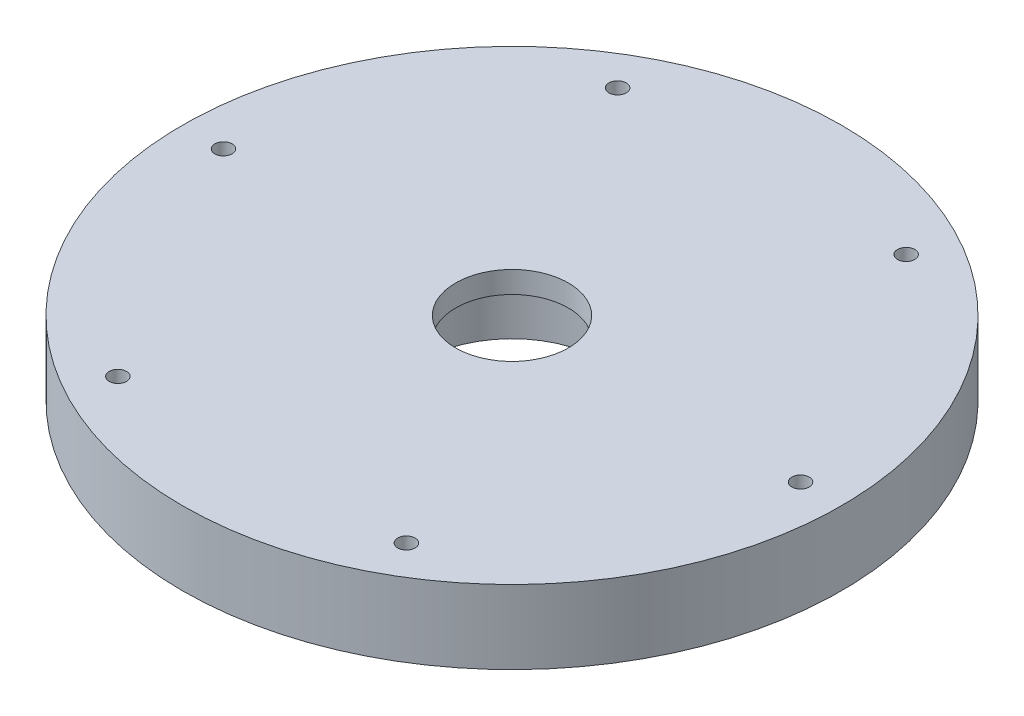
ISO-10303-21;
HEADER;
FILE_DESCRIPTION(('STEP AP214'),'2;1');
FILE_NAME('part.step','',(''),(''),'','','');
FILE_SCHEMA(('AUTOMOTIVE_DESIGN { 1 0 10303 214 1 1 1 1 }'));
ENDSEC;
DATA;
#1=APPLICATION_CONTEXT('core data for automotive mechanical design processes');
#2=APPLICATION_PROTOCOL_DEFINITION('international standard','automotive_design',2000,#1);
#3=PRODUCT_CONTEXT('',#1,'mechanical');
#4=PRODUCT('Part','Part','',(#3));
#5=PRODUCT_RELATED_PRODUCT_CATEGORY('part','',(#4));
#6=PRODUCT_DEFINITION_FORMATION('','',#4);
#7=PRODUCT_DEFINITION_CONTEXT('part definition',#1,'design');
#8=PRODUCT_DEFINITION('design','',#6,#7);
#9=PRODUCT_DEFINITION_SHAPE('','',#8);
#10=(LENGTH_UNIT() NAMED_UNIT(*) SI_UNIT(.MILLI.,.METRE.));
#11=(NAMED_UNIT(*) PLANE_ANGLE_UNIT() SI_UNIT($,.RADIAN.));
#12=(NAMED_UNIT(*) SI_UNIT($,.STERADIAN.) SOLID_ANGLE_UNIT());
#13=UNCERTAINTY_MEASURE_WITH_UNIT(LENGTH_MEASURE(1.E-05),#10,'distance_accuracy_value','');
#14=(GEOMETRIC_REPRESENTATION_CONTEXT(3) GLOBAL_UNCERTAINTY_ASSIGNED_CONTEXT((#13)) GLOBAL_UNIT_ASSIGNED_CONTEXT((#10,
#11,#12)) REPRESENTATION_CONTEXT('',''));
#15=CARTESIAN_POINT('',(0.,0.,0.));
#16=DIRECTION('',(0.,0.,1.));
#17=DIRECTION('',(1.,0.,0.));
#18=AXIS2_PLACEMENT_3D('',#15,#16,#17);
#19=CARTESIAN_POINT('',(0.,38.7086688188191,0.));
#20=DIRECTION('',(0.,1.,0.));
#21=DIRECTION('',(0.,0.,1.));
#22=AXIS2_PLACEMENT_3D('',#19,#20,#21);
#23=CYLINDRICAL_SURFACE('',#22,6.49999999999999);
#24=CARTESIAN_POINT('',(0.,0.,0.));
#25=DIRECTION('',(0.,1.,0.));
#26=DIRECTION('',(0.,0.,1.));
#27=AXIS2_PLACEMENT_3D('',#24,#25,#26);
#28=CIRCLE('',#27,6.49999999999999);
#29=CARTESIAN_POINT('',(0.,0.,6.49999999999999));
#30=VERTEX_POINT('',#29);
#31=EDGE_CURVE('E10',#30,#30,#28,.T.);
#32=ORIENTED_EDGE('',*,*,#31,.T.);
#33=EDGE_LOOP('',(#32));
#34=FACE_BOUND('',#33,.T.);
#35=CARTESIAN_POINT('',(0.,-2.5,0.));
#36=DIRECTION('',(0.,1.,0.));
#37=DIRECTION('',(0.,0.,1.));
#38=AXIS2_PLACEMENT_3D('',#35,#36,#37);
#39=CIRCLE('',#38,6.49999999999999);
#40=CARTESIAN_POINT('',(0.,-2.5,6.49999999999999));
#41=VERTEX_POINT('',#40);
#42=EDGE_CURVE('E63',#41,#41,#39,.T.);
#43=ORIENTED_EDGE('',*,*,#42,.F.);
#44=EDGE_LOOP('',(#43));
#45=FACE_BOUND('',#44,.T.);
#46=ADVANCED_FACE('F35',(#34,#45),#23,.F.);
#47=CARTESIAN_POINT('',(-6.49999999999999,0.,0.));
#48=DIRECTION('',(0.,1.,0.));
#49=DIRECTION('',(0.,0.,1.));
#50=AXIS2_PLACEMENT_3D('',#47,#48,#49);
#51=PLANE('',#50);
#52=CARTESIAN_POINT('',(-33.26875,0.,0.));
#53=DIRECTION('',(0.,-1.,0.));
#54=DIRECTION('',(0.,0.,-1.));
#55=AXIS2_PLACEMENT_3D('',#52,#53,#54);
#56=CIRCLE('',#55,0.999999999999998);
#57=CARTESIAN_POINT('',(-33.26875,0.,-0.999999999999992));
#58=VERTEX_POINT('',#57);
#59=EDGE_CURVE('E66',#58,#58,#56,.T.);
#60=ORIENTED_EDGE('',*,*,#59,.T.);
#61=EDGE_LOOP('',(#60));
#62=FACE_BOUND('',#61,.T.);
#63=CARTESIAN_POINT('',(-16.634375,0.,-28.8115826521536));
#64=DIRECTION('',(0.,-1.,0.));
#65=DIRECTION('',(0.,0.,-1.));
#66=AXIS2_PLACEMENT_3D('',#63,#64,#65);
#67=CIRCLE('',#66,0.999999999999998);
#68=CARTESIAN_POINT('',(-16.634375,0.,-29.8115826521536));
#69=VERTEX_POINT('',#68);
#70=EDGE_CURVE('E93',#69,#69,#67,.T.);
#71=ORIENTED_EDGE('',*,*,#70,.T.);
#72=EDGE_LOOP('',(#71));
#73=FACE_BOUND('',#72,.T.);
#74=CARTESIAN_POINT('',(16.634375,0.,-28.8115826521535));
#75=DIRECTION('',(0.,-1.,0.));
#76=DIRECTION('',(0.,0.,-1.));
#77=AXIS2_PLACEMENT_3D('',#74,#75,#76);
#78=CIRCLE('',#77,0.999999999999998);
#79=CARTESIAN_POINT('',(16.634375,0.,-29.8115826521535));
#80=VERTEX_POINT('',#79);
#81=EDGE_CURVE('E67',#80,#80,#78,.T.);
#82=ORIENTED_EDGE('',*,*,#81,.T.);
#83=EDGE_LOOP('',(#82));
#84=FACE_BOUND('',#83,.T.);
#85=CARTESIAN_POINT('',(33.26875,0.,0.));
#86=DIRECTION('',(0.,-1.,0.));
#87=DIRECTION('',(0.,0.,-1.));
#88=AXIS2_PLACEMENT_3D('',#85,#86,#87);
#89=CIRCLE('',#88,0.999999999999998);
#90=CARTESIAN_POINT('',(33.26875,0.,-1.));
#91=VERTEX_POINT('',#90);
#92=EDGE_CURVE('E74',#91,#91,#89,.T.);
#93=ORIENTED_EDGE('',*,*,#92,.T.);
#94=EDGE_LOOP('',(#93));
#95=FACE_BOUND('',#94,.T.);
#96=CARTESIAN_POINT('',(16.634375,0.,28.8115826521535));
#97=DIRECTION('',(0.,-1.,0.));
#98=DIRECTION('',(0.,0.,-1.));
#99=AXIS2_PLACEMENT_3D('',#96,#97,#98);
#100=CIRCLE('',#99,1.);
#101=CARTESIAN_POINT('',(16.634375,0.,27.8115826521535));
#102=VERTEX_POINT('',#101);
#103=EDGE_CURVE('E80',#102,#102,#100,.T.);
#104=ORIENTED_EDGE('',*,*,#103,.T.);
#105=EDGE_LOOP('',(#104));
#106=FACE_BOUND('',#105,.T.);
#107=CARTESIAN_POINT('',(-16.634375,0.,28.8115826521535));
#108=DIRECTION('',(0.,-1.,0.));
#109=DIRECTION('',(0.,0.,-1.));
#110=AXIS2_PLACEMENT_3D('',#107,#108,#109);
#111=CIRCLE('',#110,0.999999999999998);
#112=CARTESIAN_POINT('',(-16.634375,0.,27.8115826521535));
#113=VERTEX_POINT('',#112);
#114=EDGE_CURVE('E86',#113,#113,#111,.T.);
#115=ORIENTED_EDGE('',*,*,#114,.T.);
#116=EDGE_LOOP('',(#115));
#117=FACE_BOUND('',#116,.T.);
#118=CARTESIAN_POINT('',(0.,0.,0.));
#119=DIRECTION('',(0.,1.,0.));
#120=DIRECTION('',(0.,0.,1.));
#121=AXIS2_PLACEMENT_3D('',#118,#119,#120);
#122=CIRCLE('',#121,38.);
#123=CARTESIAN_POINT('',(0.,0.,38.));
#124=VERTEX_POINT('',#123);
#125=EDGE_CURVE('E41',#124,#124,#122,.T.);
#126=ORIENTED_EDGE('',*,*,#125,.T.);
#127=EDGE_LOOP('',(#126));
#128=FACE_BOUND('',#127,.T.);
#129=ORIENTED_EDGE('',*,*,#31,.F.);
#130=EDGE_LOOP('',(#129));
#131=FACE_BOUND('',#130,.T.);
#132=ADVANCED_FACE('F103',(#62,#73,#84,#95,#106,#117,#128,#131),#51,.T.);
#133=CARTESIAN_POINT('',(0.,38.7086688188191,0.));
#134=DIRECTION('',(0.,1.,0.));
#135=DIRECTION('',(0.,0.,1.));
#136=AXIS2_PLACEMENT_3D('',#133,#134,#135);
#137=CYLINDRICAL_SURFACE('',#136,38.);
#138=CARTESIAN_POINT('',(0.,-8.5,0.));
#139=DIRECTION('',(0.,1.,0.));
#140=DIRECTION('',(0.,0.,1.));
#141=AXIS2_PLACEMENT_3D('',#138,#139,#140);
#142=CIRCLE('',#141,38.);
#143=CARTESIAN_POINT('',(0.,-8.5,38.));
#144=VERTEX_POINT('',#143);
#145=EDGE_CURVE('E45',#144,#144,#142,.T.);
#146=ORIENTED_EDGE('',*,*,#145,.T.);
#147=EDGE_LOOP('',(#146));
#148=FACE_BOUND('',#147,.T.);
#149=ORIENTED_EDGE('',*,*,#125,.F.);
#150=EDGE_LOOP('',(#149));
#151=FACE_BOUND('',#150,.T.);
#152=ADVANCED_FACE('F141',(#148,#151),#137,.T.);
#153=CARTESIAN_POINT('',(-35.,-8.5,0.));
#154=DIRECTION('',(0.,-1.,0.));
#155=DIRECTION('',(0.,0.,-1.));
#156=AXIS2_PLACEMENT_3D('',#153,#154,#155);
#157=PLANE('',#156);
#158=CARTESIAN_POINT('',(0.,-8.5,0.));
#159=DIRECTION('',(0.,1.,0.));
#160=DIRECTION('',(0.,0.,1.));
#161=AXIS2_PLACEMENT_3D('',#158,#159,#160);
#162=CIRCLE('',#161,35.);
#163=CARTESIAN_POINT('',(0.,-8.5,35.));
#164=VERTEX_POINT('',#163);
#165=EDGE_CURVE('E49',#164,#164,#162,.T.);
#166=ORIENTED_EDGE('',*,*,#165,.T.);
#167=EDGE_LOOP('',(#166));
#168=FACE_BOUND('',#167,.T.);
#169=ORIENTED_EDGE('',*,*,#145,.F.);
#170=EDGE_LOOP('',(#169));
#171=FACE_BOUND('',#170,.T.);
#172=ADVANCED_FACE('F135',(#168,#171),#157,.T.);
#173=CARTESIAN_POINT('',(0.,38.7086688188191,0.));
#174=DIRECTION('',(0.,1.,0.));
#175=DIRECTION('',(0.,0.,1.));
#176=AXIS2_PLACEMENT_3D('',#173,#174,#175);
#177=CYLINDRICAL_SURFACE('',#176,35.);
#178=CARTESIAN_POINT('',(0.,-9.75,0.));
#179=DIRECTION('',(0.,1.,0.));
#180=DIRECTION('',(0.,0.,1.));
#181=AXIS2_PLACEMENT_3D('',#178,#179,#180);
#182=CIRCLE('',#181,35.);
#183=CARTESIAN_POINT('',(0.,-9.75,35.));
#184=VERTEX_POINT('',#183);
#185=EDGE_CURVE('E54',#184,#184,#182,.T.);
#186=ORIENTED_EDGE('',*,*,#185,.T.);
#187=EDGE_LOOP('',(#186));
#188=FACE_BOUND('',#187,.T.);
#189=ORIENTED_EDGE('',*,*,#165,.F.);
#190=EDGE_LOOP('',(#189));
#191=FACE_BOUND('',#190,.T.);
#192=ADVANCED_FACE('F117',(#188,#191),#177,.T.);
#193=CARTESIAN_POINT('',(-10.5,-9.75,0.));
#194=DIRECTION('',(0.,-1.,0.));
#195=DIRECTION('',(0.,0.,-1.));
#196=AXIS2_PLACEMENT_3D('',#193,#194,#195);
#197=PLANE('',#196);
#198=CARTESIAN_POINT('',(-33.26875,-9.75,0.));
#199=DIRECTION('',(0.,-1.,0.));
#200=DIRECTION('',(0.,0.,-1.));
#201=AXIS2_PLACEMENT_3D('',#198,#199,#200);
#202=CIRCLE('',#201,0.999999999999998);
#203=CARTESIAN_POINT('',(-33.26875,-9.75,-0.999999999999992));
#204=VERTEX_POINT('',#203);
#205=EDGE_CURVE('E92',#204,#204,#202,.T.);
#206=ORIENTED_EDGE('',*,*,#205,.F.);
#207=EDGE_LOOP('',(#206));
#208=FACE_BOUND('',#207,.T.);
#209=CARTESIAN_POINT('',(-16.634375,-9.75,-28.8115826521536));
#210=DIRECTION('',(0.,-1.,0.));
#211=DIRECTION('',(0.,0.,-1.));
#212=AXIS2_PLACEMENT_3D('',#209,#210,#211);
#213=CIRCLE('',#212,0.999999999999998);
#214=CARTESIAN_POINT('',(-16.634375,-9.75,-29.8115826521536));
#215=VERTEX_POINT('',#214);
#216=EDGE_CURVE('E71',#215,#215,#213,.T.);
#217=ORIENTED_EDGE('',*,*,#216,.F.);
#218=EDGE_LOOP('',(#217));
#219=FACE_BOUND('',#218,.T.);
#220=CARTESIAN_POINT('',(16.634375,-9.75,-28.8115826521535));
#221=DIRECTION('',(0.,-1.,0.));
#222=DIRECTION('',(0.,0.,-1.));
#223=AXIS2_PLACEMENT_3D('',#220,#221,#222);
#224=CIRCLE('',#223,0.999999999999998);
#225=CARTESIAN_POINT('',(16.634375,-9.75,-29.8115826521535));
#226=VERTEX_POINT('',#225);
#227=EDGE_CURVE('E70',#226,#226,#224,.T.);
#228=ORIENTED_EDGE('',*,*,#227,.F.);
#229=EDGE_LOOP('',(#228));
#230=FACE_BOUND('',#229,.T.);
#231=CARTESIAN_POINT('',(33.26875,-9.75,0.));
#232=DIRECTION('',(0.,-1.,0.));
#233=DIRECTION('',(0.,0.,-1.));
#234=AXIS2_PLACEMENT_3D('',#231,#232,#233);
#235=CIRCLE('',#234,0.999999999999998);
#236=CARTESIAN_POINT('',(33.26875,-9.75,-1.));
#237=VERTEX_POINT('',#236);
#238=EDGE_CURVE('E77',#237,#237,#235,.T.);
#239=ORIENTED_EDGE('',*,*,#238,.F.);
#240=EDGE_LOOP('',(#239));
#241=FACE_BOUND('',#240,.T.);
#242=CARTESIAN_POINT('',(16.634375,-9.75,28.8115826521535));
#243=DIRECTION('',(0.,-1.,0.));
#244=DIRECTION('',(0.,0.,-1.));
#245=AXIS2_PLACEMENT_3D('',#242,#243,#244);
#246=CIRCLE('',#245,1.);
#247=CARTESIAN_POINT('',(16.634375,-9.75,27.8115826521535));
#248=VERTEX_POINT('',#247);
#249=EDGE_CURVE('E83',#248,#248,#246,.T.);
#250=ORIENTED_EDGE('',*,*,#249,.F.);
#251=EDGE_LOOP('',(#250));
#252=FACE_BOUND('',#251,.T.);
#253=CARTESIAN_POINT('',(-16.634375,-9.75,28.8115826521535));
#254=DIRECTION('',(0.,-1.,0.));
#255=DIRECTION('',(0.,0.,-1.));
#256=AXIS2_PLACEMENT_3D('',#253,#254,#255);
#257=CIRCLE('',#256,0.999999999999998);
#258=CARTESIAN_POINT('',(-16.634375,-9.75,27.8115826521535));
#259=VERTEX_POINT('',#258);
#260=EDGE_CURVE('E89',#259,#259,#257,.T.);
#261=ORIENTED_EDGE('',*,*,#260,.F.);
#262=EDGE_LOOP('',(#261));
#263=FACE_BOUND('',#262,.T.);
#264=CARTESIAN_POINT('',(0.,-9.74999999999999,0.));
#265=DIRECTION('',(0.,1.,0.));
#266=DIRECTION('',(0.,0.,1.));
#267=AXIS2_PLACEMENT_3D('',#264,#265,#266);
#268=CIRCLE('',#267,10.5);
#269=CARTESIAN_POINT('',(0.,-9.74999999999999,10.5));
#270=VERTEX_POINT('',#269);
#271=EDGE_CURVE('E57',#270,#270,#268,.T.);
#272=ORIENTED_EDGE('',*,*,#271,.T.);
#273=EDGE_LOOP('',(#272));
#274=FACE_BOUND('',#273,.T.);
#275=ORIENTED_EDGE('',*,*,#185,.F.);
#276=EDGE_LOOP('',(#275));
#277=FACE_BOUND('',#276,.T.);
#278=ADVANCED_FACE('F113',(#208,#219,#230,#241,#252,#263,#274,#277),#197,.T.);
#279=CARTESIAN_POINT('',(0.,38.7086688188191,0.));
#280=DIRECTION('',(0.,1.,0.));
#281=DIRECTION('',(0.,0.,1.));
#282=AXIS2_PLACEMENT_3D('',#279,#280,#281);
#283=CYLINDRICAL_SURFACE('',#282,10.5);
#284=CARTESIAN_POINT('',(0.,-2.5,0.));
#285=DIRECTION('',(0.,1.,0.));
#286=DIRECTION('',(0.,0.,1.));
#287=AXIS2_PLACEMENT_3D('',#284,#285,#286);
#288=CIRCLE('',#287,10.5);
#289=CARTESIAN_POINT('',(0.,-2.5,10.5));
#290=VERTEX_POINT('',#289);
#291=EDGE_CURVE('E60',#290,#290,#288,.T.);
#292=ORIENTED_EDGE('',*,*,#291,.T.);
#293=EDGE_LOOP('',(#292));
#294=FACE_BOUND('',#293,.T.);
#295=ORIENTED_EDGE('',*,*,#271,.F.);
#296=EDGE_LOOP('',(#295));
#297=FACE_BOUND('',#296,.T.);
#298=ADVANCED_FACE('F116',(#294,#297),#283,.F.);
#299=CARTESIAN_POINT('',(-10.5,-2.5,0.));
#300=DIRECTION('',(0.,-1.,0.));
#301=DIRECTION('',(0.,0.,-1.));
#302=AXIS2_PLACEMENT_3D('',#299,#300,#301);
#303=PLANE('',#302);
#304=ORIENTED_EDGE('',*,*,#42,.T.);
#305=EDGE_LOOP('',(#304));
#306=FACE_BOUND('',#305,.T.);
#307=ORIENTED_EDGE('',*,*,#291,.F.);
#308=EDGE_LOOP('',(#307));
#309=FACE_BOUND('',#308,.T.);
#310=ADVANCED_FACE('F157',(#306,#309),#303,.T.);
#311=CARTESIAN_POINT('',(-16.634375,0.,28.8115826521535));
#312=DIRECTION('',(0.,-1.,0.));
#313=DIRECTION('',(0.,0.,-1.));
#314=AXIS2_PLACEMENT_3D('',#311,#312,#313);
#315=CYLINDRICAL_SURFACE('',#314,0.999999999999998);
#316=ORIENTED_EDGE('',*,*,#114,.F.);
#317=EDGE_LOOP('',(#316));
#318=FACE_BOUND('',#317,.T.);
#319=ORIENTED_EDGE('',*,*,#260,.T.);
#320=EDGE_LOOP('',(#319));
#321=FACE_BOUND('',#320,.T.);
#322=ADVANCED_FACE('F160',(#318,#321),#315,.F.);
#323=CARTESIAN_POINT('',(16.634375,0.,28.8115826521535));
#324=DIRECTION('',(0.,-1.,0.));
#325=DIRECTION('',(0.,0.,-1.));
#326=AXIS2_PLACEMENT_3D('',#323,#324,#325);
#327=CYLINDRICAL_SURFACE('',#326,1.);
#328=ORIENTED_EDGE('',*,*,#103,.F.);
#329=EDGE_LOOP('',(#328));
#330=FACE_BOUND('',#329,.T.);
#331=ORIENTED_EDGE('',*,*,#249,.T.);
#332=EDGE_LOOP('',(#331));
#333=FACE_BOUND('',#332,.T.);
#334=ADVANCED_FACE('F177',(#330,#333),#327,.F.);
#335=CARTESIAN_POINT('',(33.26875,0.,0.));
#336=DIRECTION('',(0.,-1.,0.));
#337=DIRECTION('',(0.,0.,-1.));
#338=AXIS2_PLACEMENT_3D('',#335,#336,#337);
#339=CYLINDRICAL_SURFACE('',#338,0.999999999999998);
#340=ORIENTED_EDGE('',*,*,#92,.F.);
#341=EDGE_LOOP('',(#340));
#342=FACE_BOUND('',#341,.T.);
#343=ORIENTED_EDGE('',*,*,#238,.T.);
#344=EDGE_LOOP('',(#343));
#345=FACE_BOUND('',#344,.T.);
#346=ADVANCED_FACE('F173',(#342,#345),#339,.F.);
#347=CARTESIAN_POINT('',(16.634375,0.,-28.8115826521535));
#348=DIRECTION('',(0.,-1.,0.));
#349=DIRECTION('',(0.,0.,-1.));
#350=AXIS2_PLACEMENT_3D('',#347,#348,#349);
#351=CYLINDRICAL_SURFACE('',#350,0.999999999999998);
#352=ORIENTED_EDGE('',*,*,#81,.F.);
#353=EDGE_LOOP('',(#352));
#354=FACE_BOUND('',#353,.T.);
#355=ORIENTED_EDGE('',*,*,#227,.T.);
#356=EDGE_LOOP('',(#355));
#357=FACE_BOUND('',#356,.T.);
#358=ADVANCED_FACE('F170',(#354,#357),#351,.F.);
#359=CARTESIAN_POINT('',(-16.634375,0.,-28.8115826521536));
#360=DIRECTION('',(0.,-1.,0.));
#361=DIRECTION('',(0.,0.,-1.));
#362=AXIS2_PLACEMENT_3D('',#359,#360,#361);
#363=CYLINDRICAL_SURFACE('',#362,0.999999999999998);
#364=ORIENTED_EDGE('',*,*,#70,.F.);
#365=EDGE_LOOP('',(#364));
#366=FACE_BOUND('',#365,.T.);
#367=ORIENTED_EDGE('',*,*,#216,.T.);
#368=EDGE_LOOP('',(#367));
#369=FACE_BOUND('',#368,.T.);
#370=ADVANCED_FACE('F109',(#366,#369),#363,.F.);
#371=CARTESIAN_POINT('',(-33.26875,0.,0.));
#372=DIRECTION('',(0.,-1.,0.));
#373=DIRECTION('',(0.,0.,-1.));
#374=AXIS2_PLACEMENT_3D('',#371,#372,#373);
#375=CYLINDRICAL_SURFACE('',#374,0.999999999999998);
#376=ORIENTED_EDGE('',*,*,#59,.F.);
#377=EDGE_LOOP('',(#376));
#378=FACE_BOUND('',#377,.T.);
#379=ORIENTED_EDGE('',*,*,#205,.T.);
#380=EDGE_LOOP('',(#379));
#381=FACE_BOUND('',#380,.T.);
#382=ADVANCED_FACE('F106',(#378,#381),#375,.F.);
#383=CLOSED_SHELL('',(#46,#132,#152,#172,#192,#278,#298,#310,#322,#334,#346,#358,#370,#382));
#384=MANIFOLD_SOLID_BREP('B2',#383);
#385=ADVANCED_BREP_SHAPE_REPRESENTATION('',(#18,#384),#14);
#386=SHAPE_DEFINITION_REPRESENTATION(#9,#385);
ENDSEC;
END-ISO-10303-21;
